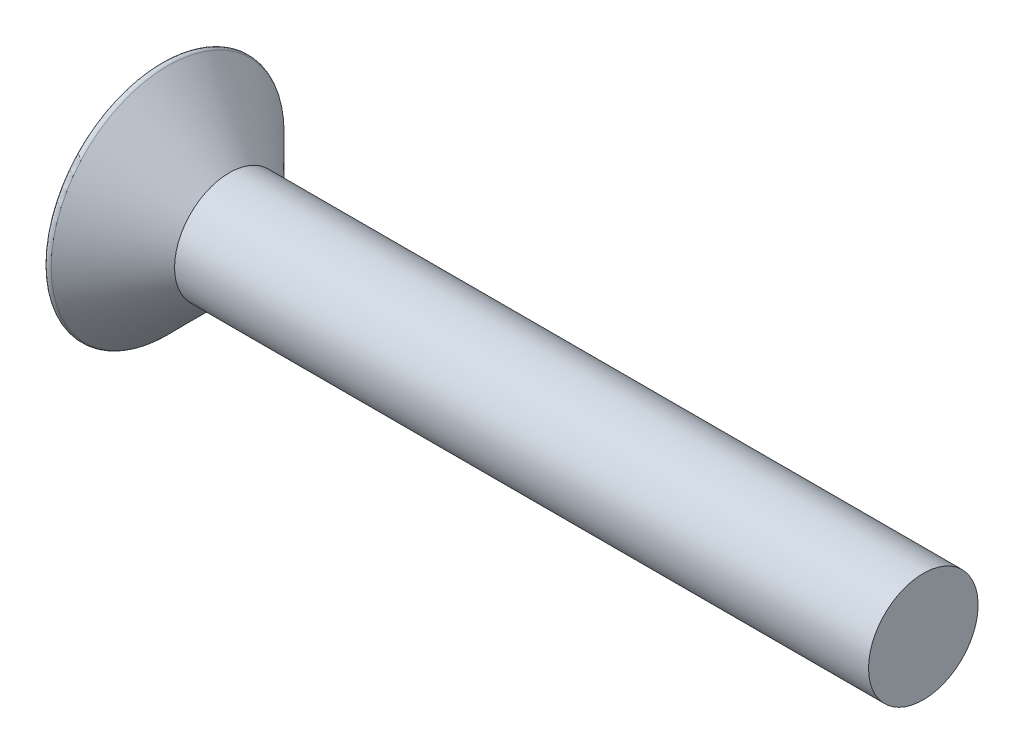
ISO-10303-21;
HEADER;
FILE_DESCRIPTION(('STEP AP214'),'2;1');
FILE_NAME('part.step','',(''),(''),'','','');
FILE_SCHEMA(('AUTOMOTIVE_DESIGN { 1 0 10303 214 1 1 1 1 }'));
ENDSEC;
DATA;
#1=APPLICATION_CONTEXT('core data for automotive mechanical design processes');
#2=APPLICATION_PROTOCOL_DEFINITION('international standard','automotive_design',2000,#1);
#3=PRODUCT_CONTEXT('',#1,'mechanical');
#4=PRODUCT('Part','Part','',(#3));
#5=PRODUCT_RELATED_PRODUCT_CATEGORY('part','',(#4));
#6=PRODUCT_DEFINITION_FORMATION('','',#4);
#7=PRODUCT_DEFINITION_CONTEXT('part definition',#1,'design');
#8=PRODUCT_DEFINITION('design','',#6,#7);
#9=PRODUCT_DEFINITION_SHAPE('','',#8);
#10=(LENGTH_UNIT() NAMED_UNIT(*) SI_UNIT(.MILLI.,.METRE.));
#11=(NAMED_UNIT(*) PLANE_ANGLE_UNIT() SI_UNIT($,.RADIAN.));
#12=(NAMED_UNIT(*) SI_UNIT($,.STERADIAN.) SOLID_ANGLE_UNIT());
#13=UNCERTAINTY_MEASURE_WITH_UNIT(LENGTH_MEASURE(1.E-05),#10,'distance_accuracy_value','');
#14=(GEOMETRIC_REPRESENTATION_CONTEXT(3) GLOBAL_UNCERTAINTY_ASSIGNED_CONTEXT((#13)) GLOBAL_UNIT_ASSIGNED_CONTEXT((#10,
#11,#12)) REPRESENTATION_CONTEXT('',''));
#15=CARTESIAN_POINT('',(0.,0.,0.));
#16=DIRECTION('',(0.,0.,1.));
#17=DIRECTION('',(1.,0.,0.));
#18=AXIS2_PLACEMENT_3D('',#15,#16,#17);
#19=CARTESIAN_POINT('',(0.,0.,0.));
#20=DIRECTION('',(1.,0.,0.));
#21=DIRECTION('',(0.,0.,-1.));
#22=AXIS2_PLACEMENT_3D('',#19,#20,#21);
#23=PLANE('',#22);
#24=CARTESIAN_POINT('',(0.,0.,0.));
#25=DIRECTION('',(1.,0.,0.));
#26=DIRECTION('',(0.,0.,-1.));
#27=AXIS2_PLACEMENT_3D('',#24,#25,#26);
#28=CIRCLE('',#27,3.11857864376269);
#29=CARTESIAN_POINT('',(0.,0.,-3.11857864376269));
#30=VERTEX_POINT('',#29);
#31=EDGE_CURVE('E45',#30,#30,#28,.F.);
#32=ORIENTED_EDGE('',*,*,#31,.T.);
#33=EDGE_LOOP('',(#32));
#34=FACE_BOUND('',#33,.T.);
#35=ADVANCED_FACE('F37',(#34),#23,.F.);
#36=CARTESIAN_POINT('',(1.86,0.,0.));
#37=DIRECTION('',(-1.,0.,0.));
#38=DIRECTION('',(0.,0.,1.));
#39=AXIS2_PLACEMENT_3D('',#36,#37,#38);
#40=CONICAL_SURFACE('',#39,1.49999999999999,0.78539816339745);
#41=CARTESIAN_POINT('',(0.170710678118655,0.,0.));
#42=DIRECTION('',(1.,0.,0.));
#43=DIRECTION('',(0.,0.,-1.));
#44=AXIS2_PLACEMENT_3D('',#41,#42,#43);
#45=CIRCLE('',#44,3.18928932188134);
#46=CARTESIAN_POINT('',(0.170710678118655,0.,-3.18928932188134));
#47=VERTEX_POINT('',#46);
#48=EDGE_CURVE('E10',#47,#47,#45,.T.);
#49=ORIENTED_EDGE('',*,*,#48,.T.);
#50=EDGE_LOOP('',(#49));
#51=FACE_BOUND('',#50,.T.);
#52=CARTESIAN_POINT('',(1.86,0.,0.));
#53=DIRECTION('',(-1.,0.,0.));
#54=DIRECTION('',(0.,0.,1.));
#55=AXIS2_PLACEMENT_3D('',#52,#53,#54);
#56=CIRCLE('',#55,1.49999999999999);
#57=CARTESIAN_POINT('',(1.86,0.,1.49999999999999));
#58=VERTEX_POINT('',#57);
#59=EDGE_CURVE('E50',#58,#58,#56,.T.);
#60=ORIENTED_EDGE('',*,*,#59,.T.);
#61=EDGE_LOOP('',(#60));
#62=FACE_BOUND('',#61,.T.);
#63=ADVANCED_FACE('F72',(#51,#62),#40,.T.);
#64=CARTESIAN_POINT('',(0.,0.,0.));
#65=DIRECTION('',(-1.,0.,0.));
#66=DIRECTION('',(0.,0.,1.));
#67=AXIS2_PLACEMENT_3D('',#64,#65,#66);
#68=CYLINDRICAL_SURFACE('',#67,1.49999999999999);
#69=ORIENTED_EDGE('',*,*,#59,.F.);
#70=EDGE_LOOP('',(#69));
#71=FACE_BOUND('',#70,.T.);
#72=CARTESIAN_POINT('',(20.86,0.,0.));
#73=DIRECTION('',(-1.,0.,0.));
#74=DIRECTION('',(0.,0.,1.));
#75=AXIS2_PLACEMENT_3D('',#72,#73,#74);
#76=CIRCLE('',#75,1.49999999999999);
#77=CARTESIAN_POINT('',(20.86,0.,1.49999999999999));
#78=VERTEX_POINT('',#77);
#79=EDGE_CURVE('E55',#78,#78,#76,.T.);
#80=ORIENTED_EDGE('',*,*,#79,.T.);
#81=EDGE_LOOP('',(#80));
#82=FACE_BOUND('',#81,.T.);
#83=ADVANCED_FACE('F62',(#71,#82),#68,.T.);
#84=CARTESIAN_POINT('',(20.86,1.49999999999999,0.));
#85=DIRECTION('',(-1.,0.,0.));
#86=DIRECTION('',(0.,0.,1.));
#87=AXIS2_PLACEMENT_3D('',#84,#85,#86);
#88=PLANE('',#87);
#89=ORIENTED_EDGE('',*,*,#79,.F.);
#90=EDGE_LOOP('',(#89));
#91=FACE_BOUND('',#90,.T.);
#92=ADVANCED_FACE('F64',(#91),#88,.F.);
#93=CARTESIAN_POINT('',(0.1,0.,0.));
#94=DIRECTION('',(1.,0.,0.));
#95=DIRECTION('',(0.,0.,-1.));
#96=AXIS2_PLACEMENT_3D('',#93,#94,#95);
#97=TOROIDAL_SURFACE('',#96,3.11857864376269,0.1);
#98=ORIENTED_EDGE('',*,*,#48,.F.);
#99=EDGE_LOOP('',(#98));
#100=FACE_BOUND('',#99,.T.);
#101=ORIENTED_EDGE('',*,*,#31,.F.);
#102=EDGE_LOOP('',(#101));
#103=FACE_BOUND('',#102,.T.);
#104=ADVANCED_FACE('F39',(#100,#103),#97,.T.);
#105=CLOSED_SHELL('',(#35,#63,#83,#92,#104));
#106=MANIFOLD_SOLID_BREP('B2',#105);
#107=ADVANCED_BREP_SHAPE_REPRESENTATION('',(#18,#106),#14);
#108=SHAPE_DEFINITION_REPRESENTATION(#9,#107);
ENDSEC;
END-ISO-10303-21;
